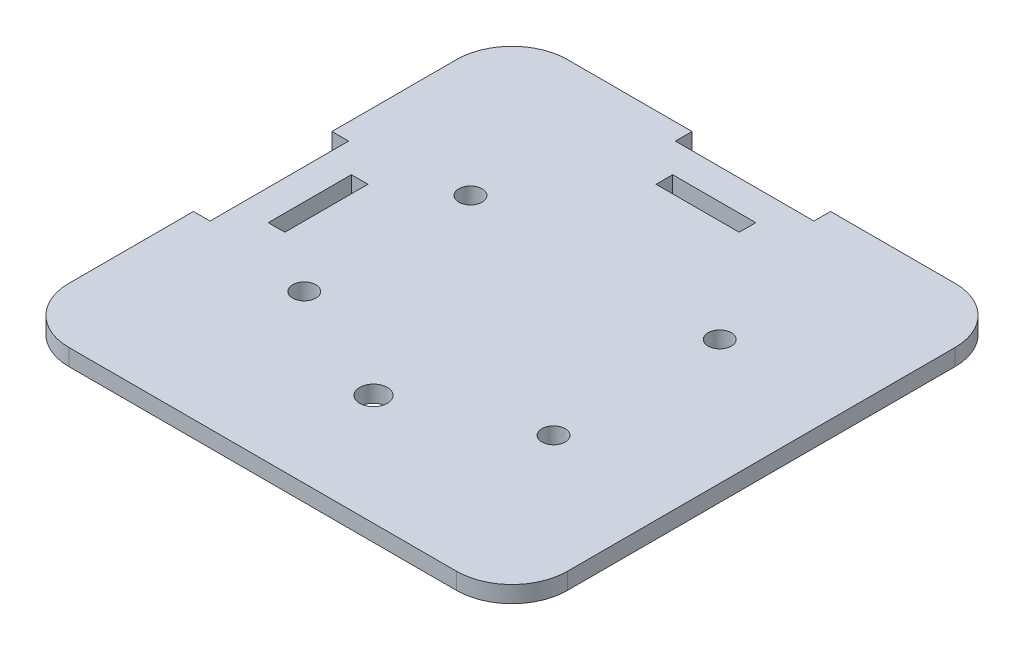
ISO-10303-21;
HEADER;
FILE_DESCRIPTION(('STEP AP214'),'2;1');
FILE_NAME('part.step','',(''),(''),'','','');
FILE_SCHEMA(('AUTOMOTIVE_DESIGN { 1 0 10303 214 1 1 1 1 }'));
ENDSEC;
DATA;
#1=APPLICATION_CONTEXT('core data for automotive mechanical design processes');
#2=APPLICATION_PROTOCOL_DEFINITION('international standard','automotive_design',2000,#1);
#3=PRODUCT_CONTEXT('',#1,'mechanical');
#4=PRODUCT('Part','Part','',(#3));
#5=PRODUCT_RELATED_PRODUCT_CATEGORY('part','',(#4));
#6=PRODUCT_DEFINITION_FORMATION('','',#4);
#7=PRODUCT_DEFINITION_CONTEXT('part definition',#1,'design');
#8=PRODUCT_DEFINITION('design','',#6,#7);
#9=PRODUCT_DEFINITION_SHAPE('','',#8);
#10=(LENGTH_UNIT() NAMED_UNIT(*) SI_UNIT(.MILLI.,.METRE.));
#11=(NAMED_UNIT(*) PLANE_ANGLE_UNIT() SI_UNIT($,.RADIAN.));
#12=(NAMED_UNIT(*) SI_UNIT($,.STERADIAN.) SOLID_ANGLE_UNIT());
#13=UNCERTAINTY_MEASURE_WITH_UNIT(LENGTH_MEASURE(1.E-05),#10,'distance_accuracy_value','');
#14=(GEOMETRIC_REPRESENTATION_CONTEXT(3) GLOBAL_UNCERTAINTY_ASSIGNED_CONTEXT((#13)) GLOBAL_UNIT_ASSIGNED_CONTEXT((#10,
#11,#12)) REPRESENTATION_CONTEXT('',''));
#15=CARTESIAN_POINT('',(0.,0.,0.));
#16=DIRECTION('',(0.,0.,1.));
#17=DIRECTION('',(1.,0.,0.));
#18=AXIS2_PLACEMENT_3D('',#15,#16,#17);
#19=CARTESIAN_POINT('',(-35.,3.,-35.));
#20=DIRECTION('',(0.,-1.,0.));
#21=DIRECTION('',(0.,0.,-1.));
#22=AXIS2_PLACEMENT_3D('',#19,#20,#21);
#23=CYLINDRICAL_SURFACE('',#22,10.);
#24=CARTESIAN_POINT('',(-35.,0.,-35.));
#25=DIRECTION('',(0.,1.,0.));
#26=DIRECTION('',(0.,0.,1.));
#27=AXIS2_PLACEMENT_3D('',#24,#25,#26);
#28=CIRCLE('',#27,10.);
#29=CARTESIAN_POINT('',(-45.,0.,-35.));
#30=VERTEX_POINT('',#29);
#31=CARTESIAN_POINT('',(-35.,0.,-45.));
#32=VERTEX_POINT('',#31);
#33=EDGE_CURVE('E269',#30,#32,#28,.F.);
#34=ORIENTED_EDGE('',*,*,#33,.F.);
#35=DIRECTION('',(0.,-1.,0.));
#36=VECTOR('',#35,1.);
#37=CARTESIAN_POINT('',(-45.,3.,-35.));
#38=LINE('',#37,#36);
#39=CARTESIAN_POINT('',(-45.,3.,-35.));
#40=VERTEX_POINT('',#39);
#41=EDGE_CURVE('E381',#40,#30,#38,.T.);
#42=ORIENTED_EDGE('',*,*,#41,.F.);
#43=CARTESIAN_POINT('',(-35.,3.,-35.));
#44=DIRECTION('',(0.,1.,0.));
#45=DIRECTION('',(0.,0.,1.));
#46=AXIS2_PLACEMENT_3D('',#43,#44,#45);
#47=CIRCLE('',#46,10.);
#48=CARTESIAN_POINT('',(-35.,3.,-45.));
#49=VERTEX_POINT('',#48);
#50=EDGE_CURVE('E272',#40,#49,#47,.F.);
#51=ORIENTED_EDGE('',*,*,#50,.T.);
#52=DIRECTION('',(0.,-1.,0.));
#53=VECTOR('',#52,1.);
#54=CARTESIAN_POINT('',(-35.,3.,-45.));
#55=LINE('',#54,#53);
#56=EDGE_CURVE('E346',#49,#32,#55,.T.);
#57=ORIENTED_EDGE('',*,*,#56,.T.);
#58=EDGE_LOOP('',(#34,#42,#51,#57));
#59=FACE_BOUND('',#58,.T.);
#60=ADVANCED_FACE('F35',(#59),#23,.T.);
#61=CARTESIAN_POINT('',(-45.,3.,0.));
#62=DIRECTION('',(-1.,0.,0.));
#63=DIRECTION('',(0.,0.,1.));
#64=AXIS2_PLACEMENT_3D('',#61,#62,#63);
#65=PLANE('',#64);
#66=DIRECTION('',(0.,0.,-1.));
#67=VECTOR('',#66,1.);
#68=CARTESIAN_POINT('',(-45.,0.,0.));
#69=LINE('',#68,#67);
#70=CARTESIAN_POINT('',(-45.,0.,-12.5));
#71=VERTEX_POINT('',#70);
#72=EDGE_CURVE('E311',#71,#30,#69,.T.);
#73=ORIENTED_EDGE('',*,*,#72,.F.);
#74=DIRECTION('',(0.,-1.,0.));
#75=VECTOR('',#74,1.);
#76=CARTESIAN_POINT('',(-45.,3.,-12.5));
#77=LINE('',#76,#75);
#78=CARTESIAN_POINT('',(-45.,3.,-12.5));
#79=VERTEX_POINT('',#78);
#80=EDGE_CURVE('E379',#79,#71,#77,.T.);
#81=ORIENTED_EDGE('',*,*,#80,.F.);
#82=DIRECTION('',(0.,0.,-1.));
#83=VECTOR('',#82,1.);
#84=CARTESIAN_POINT('',(-45.,3.,0.));
#85=LINE('',#84,#83);
#86=EDGE_CURVE('E275',#79,#40,#85,.T.);
#87=ORIENTED_EDGE('',*,*,#86,.T.);
#88=ORIENTED_EDGE('',*,*,#41,.T.);
#89=EDGE_LOOP('',(#73,#81,#87,#88));
#90=FACE_BOUND('',#89,.T.);
#91=ADVANCED_FACE('F420',(#90),#65,.T.);
#92=CARTESIAN_POINT('',(0.,3.,-12.5));
#93=DIRECTION('',(0.,0.,-1.));
#94=DIRECTION('',(-1.,0.,0.));
#95=AXIS2_PLACEMENT_3D('',#92,#93,#94);
#96=PLANE('',#95);
#97=DIRECTION('',(1.,0.,0.));
#98=VECTOR('',#97,1.);
#99=CARTESIAN_POINT('',(0.,0.,-12.5));
#100=LINE('',#99,#98);
#101=CARTESIAN_POINT('',(-42.,0.,-12.5));
#102=VERTEX_POINT('',#101);
#103=EDGE_CURVE('E314',#71,#102,#100,.T.);
#104=ORIENTED_EDGE('',*,*,#103,.T.);
#105=DIRECTION('',(0.,-1.,0.));
#106=VECTOR('',#105,1.);
#107=CARTESIAN_POINT('',(-42.,3.,-12.5));
#108=LINE('',#107,#106);
#109=CARTESIAN_POINT('',(-42.,3.,-12.5));
#110=VERTEX_POINT('',#109);
#111=EDGE_CURVE('E376',#110,#102,#108,.T.);
#112=ORIENTED_EDGE('',*,*,#111,.F.);
#113=DIRECTION('',(1.,0.,0.));
#114=VECTOR('',#113,1.);
#115=CARTESIAN_POINT('',(0.,3.,-12.5));
#116=LINE('',#115,#114);
#117=EDGE_CURVE('E279',#79,#110,#116,.T.);
#118=ORIENTED_EDGE('',*,*,#117,.F.);
#119=ORIENTED_EDGE('',*,*,#80,.T.);
#120=EDGE_LOOP('',(#104,#112,#118,#119));
#121=FACE_BOUND('',#120,.T.);
#122=ADVANCED_FACE('F425',(#121),#96,.F.);
#123=CARTESIAN_POINT('',(-42.,3.,0.));
#124=DIRECTION('',(1.,0.,0.));
#125=DIRECTION('',(0.,0.,-1.));
#126=AXIS2_PLACEMENT_3D('',#123,#124,#125);
#127=PLANE('',#126);
#128=DIRECTION('',(0.,0.,1.));
#129=VECTOR('',#128,1.);
#130=CARTESIAN_POINT('',(-42.,0.,0.));
#131=LINE('',#130,#129);
#132=CARTESIAN_POINT('',(-42.,0.,12.5));
#133=VERTEX_POINT('',#132);
#134=EDGE_CURVE('E317',#102,#133,#131,.T.);
#135=ORIENTED_EDGE('',*,*,#134,.T.);
#136=DIRECTION('',(0.,-1.,0.));
#137=VECTOR('',#136,1.);
#138=CARTESIAN_POINT('',(-42.,3.,12.5));
#139=LINE('',#138,#137);
#140=CARTESIAN_POINT('',(-42.,3.,12.5));
#141=VERTEX_POINT('',#140);
#142=EDGE_CURVE('E374',#141,#133,#139,.T.);
#143=ORIENTED_EDGE('',*,*,#142,.F.);
#144=DIRECTION('',(0.,0.,1.));
#145=VECTOR('',#144,1.);
#146=CARTESIAN_POINT('',(-42.,3.,0.));
#147=LINE('',#146,#145);
#148=EDGE_CURVE('E282',#110,#141,#147,.T.);
#149=ORIENTED_EDGE('',*,*,#148,.F.);
#150=ORIENTED_EDGE('',*,*,#111,.T.);
#151=EDGE_LOOP('',(#135,#143,#149,#150));
#152=FACE_BOUND('',#151,.T.);
#153=ADVANCED_FACE('F497',(#152),#127,.F.);
#154=CARTESIAN_POINT('',(0.,3.,12.5));
#155=DIRECTION('',(0.,0.,-1.));
#156=DIRECTION('',(-1.,0.,0.));
#157=AXIS2_PLACEMENT_3D('',#154,#155,#156);
#158=PLANE('',#157);
#159=DIRECTION('',(1.,0.,0.));
#160=VECTOR('',#159,1.);
#161=CARTESIAN_POINT('',(0.,0.,12.5));
#162=LINE('',#161,#160);
#163=CARTESIAN_POINT('',(-45.,0.,12.5));
#164=VERTEX_POINT('',#163);
#165=EDGE_CURVE('E320',#164,#133,#162,.T.);
#166=ORIENTED_EDGE('',*,*,#165,.F.);
#167=DIRECTION('',(0.,-1.,0.));
#168=VECTOR('',#167,1.);
#169=CARTESIAN_POINT('',(-45.,3.,12.5));
#170=LINE('',#169,#168);
#171=CARTESIAN_POINT('',(-45.,3.,12.5));
#172=VERTEX_POINT('',#171);
#173=EDGE_CURVE('E372',#172,#164,#170,.T.);
#174=ORIENTED_EDGE('',*,*,#173,.F.);
#175=DIRECTION('',(1.,0.,0.));
#176=VECTOR('',#175,1.);
#177=CARTESIAN_POINT('',(0.,3.,12.5));
#178=LINE('',#177,#176);
#179=EDGE_CURVE('E284',#172,#141,#178,.T.);
#180=ORIENTED_EDGE('',*,*,#179,.T.);
#181=ORIENTED_EDGE('',*,*,#142,.T.);
#182=EDGE_LOOP('',(#166,#174,#180,#181));
#183=FACE_BOUND('',#182,.T.);
#184=ADVANCED_FACE('F494',(#183),#158,.T.);
#185=CARTESIAN_POINT('',(-45.,0.,35.));
#186=VERTEX_POINT('',#185);
#187=EDGE_CURVE('E315',#186,#164,#69,.T.);
#188=ORIENTED_EDGE('',*,*,#187,.F.);
#189=DIRECTION('',(0.,-1.,0.));
#190=VECTOR('',#189,1.);
#191=CARTESIAN_POINT('',(-45.,3.,35.));
#192=LINE('',#191,#190);
#193=CARTESIAN_POINT('',(-45.,3.,35.));
#194=VERTEX_POINT('',#193);
#195=EDGE_CURVE('E370',#194,#186,#192,.T.);
#196=ORIENTED_EDGE('',*,*,#195,.F.);
#197=EDGE_CURVE('E280',#194,#172,#85,.T.);
#198=ORIENTED_EDGE('',*,*,#197,.T.);
#199=ORIENTED_EDGE('',*,*,#173,.T.);
#200=EDGE_LOOP('',(#188,#196,#198,#199));
#201=FACE_BOUND('',#200,.T.);
#202=ADVANCED_FACE('F428',(#201),#65,.T.);
#203=CARTESIAN_POINT('',(-35.,3.,35.));
#204=DIRECTION('',(0.,-1.,0.));
#205=DIRECTION('',(0.,0.,-1.));
#206=AXIS2_PLACEMENT_3D('',#203,#204,#205);
#207=CYLINDRICAL_SURFACE('',#206,10.);
#208=CARTESIAN_POINT('',(-35.,0.,35.));
#209=DIRECTION('',(0.,1.,0.));
#210=DIRECTION('',(0.,0.,1.));
#211=AXIS2_PLACEMENT_3D('',#208,#209,#210);
#212=CIRCLE('',#211,10.);
#213=CARTESIAN_POINT('',(-35.,0.,45.));
#214=VERTEX_POINT('',#213);
#215=EDGE_CURVE('E323',#186,#214,#212,.T.);
#216=ORIENTED_EDGE('',*,*,#215,.T.);
#217=DIRECTION('',(0.,-1.,0.));
#218=VECTOR('',#217,1.);
#219=CARTESIAN_POINT('',(-35.,3.,45.));
#220=LINE('',#219,#218);
#221=CARTESIAN_POINT('',(-35.,3.,45.));
#222=VERTEX_POINT('',#221);
#223=EDGE_CURVE('E368',#222,#214,#220,.T.);
#224=ORIENTED_EDGE('',*,*,#223,.F.);
#225=CARTESIAN_POINT('',(-35.,3.,35.));
#226=DIRECTION('',(0.,1.,0.));
#227=DIRECTION('',(0.,0.,1.));
#228=AXIS2_PLACEMENT_3D('',#225,#226,#227);
#229=CIRCLE('',#228,10.);
#230=EDGE_CURVE('E287',#194,#222,#229,.T.);
#231=ORIENTED_EDGE('',*,*,#230,.F.);
#232=ORIENTED_EDGE('',*,*,#195,.T.);
#233=EDGE_LOOP('',(#216,#224,#231,#232));
#234=FACE_BOUND('',#233,.T.);
#235=ADVANCED_FACE('F509',(#234),#207,.T.);
#236=CARTESIAN_POINT('',(0.,3.,45.));
#237=DIRECTION('',(0.,0.,1.));
#238=DIRECTION('',(1.,0.,0.));
#239=AXIS2_PLACEMENT_3D('',#236,#237,#238);
#240=PLANE('',#239);
#241=DIRECTION('',(-1.,0.,0.));
#242=VECTOR('',#241,1.);
#243=CARTESIAN_POINT('',(0.,0.,45.));
#244=LINE('',#243,#242);
#245=CARTESIAN_POINT('',(35.,0.,45.));
#246=VERTEX_POINT('',#245);
#247=EDGE_CURVE('E326',#246,#214,#244,.T.);
#248=ORIENTED_EDGE('',*,*,#247,.F.);
#249=DIRECTION('',(0.,-1.,0.));
#250=VECTOR('',#249,1.);
#251=CARTESIAN_POINT('',(35.,3.,45.));
#252=LINE('',#251,#250);
#253=CARTESIAN_POINT('',(35.,3.,45.));
#254=VERTEX_POINT('',#253);
#255=EDGE_CURVE('E366',#254,#246,#252,.T.);
#256=ORIENTED_EDGE('',*,*,#255,.F.);
#257=DIRECTION('',(-1.,0.,0.));
#258=VECTOR('',#257,1.);
#259=CARTESIAN_POINT('',(0.,3.,45.));
#260=LINE('',#259,#258);
#261=EDGE_CURVE('E289',#254,#222,#260,.T.);
#262=ORIENTED_EDGE('',*,*,#261,.T.);
#263=ORIENTED_EDGE('',*,*,#223,.T.);
#264=EDGE_LOOP('',(#248,#256,#262,#263));
#265=FACE_BOUND('',#264,.T.);
#266=ADVANCED_FACE('F481',(#265),#240,.T.);
#267=CARTESIAN_POINT('',(35.,3.,35.));
#268=DIRECTION('',(0.,-1.,0.));
#269=DIRECTION('',(0.,0.,-1.));
#270=AXIS2_PLACEMENT_3D('',#267,#268,#269);
#271=CYLINDRICAL_SURFACE('',#270,10.);
#272=CARTESIAN_POINT('',(35.,0.,35.));
#273=DIRECTION('',(0.,1.,0.));
#274=DIRECTION('',(0.,0.,1.));
#275=AXIS2_PLACEMENT_3D('',#272,#273,#274);
#276=CIRCLE('',#275,10.);
#277=CARTESIAN_POINT('',(45.,0.,35.));
#278=VERTEX_POINT('',#277);
#279=EDGE_CURVE('E329',#246,#278,#276,.T.);
#280=ORIENTED_EDGE('',*,*,#279,.T.);
#281=DIRECTION('',(0.,-1.,0.));
#282=VECTOR('',#281,1.);
#283=CARTESIAN_POINT('',(45.,3.,35.));
#284=LINE('',#283,#282);
#285=CARTESIAN_POINT('',(45.,3.,35.));
#286=VERTEX_POINT('',#285);
#287=EDGE_CURVE('E363',#286,#278,#284,.T.);
#288=ORIENTED_EDGE('',*,*,#287,.F.);
#289=CARTESIAN_POINT('',(35.,3.,35.));
#290=DIRECTION('',(0.,1.,0.));
#291=DIRECTION('',(0.,0.,1.));
#292=AXIS2_PLACEMENT_3D('',#289,#290,#291);
#293=CIRCLE('',#292,10.);
#294=EDGE_CURVE('E292',#254,#286,#293,.T.);
#295=ORIENTED_EDGE('',*,*,#294,.F.);
#296=ORIENTED_EDGE('',*,*,#255,.T.);
#297=EDGE_LOOP('',(#280,#288,#295,#296));
#298=FACE_BOUND('',#297,.T.);
#299=ADVANCED_FACE('F478',(#298),#271,.T.);
#300=CARTESIAN_POINT('',(45.,3.,0.));
#301=DIRECTION('',(-1.,0.,0.));
#302=DIRECTION('',(0.,0.,1.));
#303=AXIS2_PLACEMENT_3D('',#300,#301,#302);
#304=PLANE('',#303);
#305=DIRECTION('',(0.,0.,-1.));
#306=VECTOR('',#305,1.);
#307=CARTESIAN_POINT('',(45.,0.,0.));
#308=LINE('',#307,#306);
#309=CARTESIAN_POINT('',(45.,0.,-35.));
#310=VERTEX_POINT('',#309);
#311=EDGE_CURVE('E331',#278,#310,#308,.T.);
#312=ORIENTED_EDGE('',*,*,#311,.T.);
#313=DIRECTION('',(0.,-1.,0.));
#314=VECTOR('',#313,1.);
#315=CARTESIAN_POINT('',(45.,3.,-35.));
#316=LINE('',#315,#314);
#317=CARTESIAN_POINT('',(45.,3.,-35.));
#318=VERTEX_POINT('',#317);
#319=EDGE_CURVE('E360',#318,#310,#316,.T.);
#320=ORIENTED_EDGE('',*,*,#319,.F.);
#321=DIRECTION('',(0.,0.,-1.));
#322=VECTOR('',#321,1.);
#323=CARTESIAN_POINT('',(45.,3.,0.));
#324=LINE('',#323,#322);
#325=EDGE_CURVE('E294',#286,#318,#324,.T.);
#326=ORIENTED_EDGE('',*,*,#325,.F.);
#327=ORIENTED_EDGE('',*,*,#287,.T.);
#328=EDGE_LOOP('',(#312,#320,#326,#327));
#329=FACE_BOUND('',#328,.T.);
#330=ADVANCED_FACE('F473',(#329),#304,.F.);
#331=CARTESIAN_POINT('',(35.,3.,-35.));
#332=DIRECTION('',(0.,-1.,0.));
#333=DIRECTION('',(0.,0.,-1.));
#334=AXIS2_PLACEMENT_3D('',#331,#332,#333);
#335=CYLINDRICAL_SURFACE('',#334,10.);
#336=CARTESIAN_POINT('',(35.,0.,-35.));
#337=DIRECTION('',(0.,1.,0.));
#338=DIRECTION('',(0.,0.,1.));
#339=AXIS2_PLACEMENT_3D('',#336,#337,#338);
#340=CIRCLE('',#339,10.);
#341=CARTESIAN_POINT('',(35.,0.,-45.));
#342=VERTEX_POINT('',#341);
#343=EDGE_CURVE('E333',#310,#342,#340,.T.);
#344=ORIENTED_EDGE('',*,*,#343,.T.);
#345=DIRECTION('',(0.,-1.,0.));
#346=VECTOR('',#345,1.);
#347=CARTESIAN_POINT('',(35.,3.,-45.));
#348=LINE('',#347,#346);
#349=CARTESIAN_POINT('',(35.,3.,-45.));
#350=VERTEX_POINT('',#349);
#351=EDGE_CURVE('E357',#350,#342,#348,.T.);
#352=ORIENTED_EDGE('',*,*,#351,.F.);
#353=CARTESIAN_POINT('',(35.,3.,-35.));
#354=DIRECTION('',(0.,1.,0.));
#355=DIRECTION('',(0.,0.,1.));
#356=AXIS2_PLACEMENT_3D('',#353,#354,#355);
#357=CIRCLE('',#356,10.);
#358=EDGE_CURVE('E296',#318,#350,#357,.T.);
#359=ORIENTED_EDGE('',*,*,#358,.F.);
#360=ORIENTED_EDGE('',*,*,#319,.T.);
#361=EDGE_LOOP('',(#344,#352,#359,#360));
#362=FACE_BOUND('',#361,.T.);
#363=ADVANCED_FACE('F467',(#362),#335,.T.);
#364=CARTESIAN_POINT('',(0.,3.,-45.));
#365=DIRECTION('',(0.,0.,1.));
#366=DIRECTION('',(1.,0.,0.));
#367=AXIS2_PLACEMENT_3D('',#364,#365,#366);
#368=PLANE('',#367);
#369=DIRECTION('',(-1.,0.,0.));
#370=VECTOR('',#369,1.);
#371=CARTESIAN_POINT('',(0.,0.,-45.));
#372=LINE('',#371,#370);
#373=CARTESIAN_POINT('',(12.5,0.,-45.));
#374=VERTEX_POINT('',#373);
#375=EDGE_CURVE('E335',#342,#374,#372,.T.);
#376=ORIENTED_EDGE('',*,*,#375,.T.);
#377=DIRECTION('',(0.,-1.,0.));
#378=VECTOR('',#377,1.);
#379=CARTESIAN_POINT('',(12.5,3.,-45.));
#380=LINE('',#379,#378);
#381=CARTESIAN_POINT('',(12.5,3.,-45.));
#382=VERTEX_POINT('',#381);
#383=EDGE_CURVE('E354',#382,#374,#380,.T.);
#384=ORIENTED_EDGE('',*,*,#383,.F.);
#385=DIRECTION('',(-1.,0.,0.));
#386=VECTOR('',#385,1.);
#387=CARTESIAN_POINT('',(0.,3.,-45.));
#388=LINE('',#387,#386);
#389=EDGE_CURVE('E298',#350,#382,#388,.T.);
#390=ORIENTED_EDGE('',*,*,#389,.F.);
#391=ORIENTED_EDGE('',*,*,#351,.T.);
#392=EDGE_LOOP('',(#376,#384,#390,#391));
#393=FACE_BOUND('',#392,.T.);
#394=ADVANCED_FACE('F463',(#393),#368,.F.);
#395=CARTESIAN_POINT('',(12.5,3.,0.));
#396=DIRECTION('',(1.,0.,0.));
#397=DIRECTION('',(0.,0.,-1.));
#398=AXIS2_PLACEMENT_3D('',#395,#396,#397);
#399=PLANE('',#398);
#400=DIRECTION('',(0.,0.,1.));
#401=VECTOR('',#400,1.);
#402=CARTESIAN_POINT('',(12.5,0.,0.));
#403=LINE('',#402,#401);
#404=CARTESIAN_POINT('',(12.5,0.,-42.));
#405=VERTEX_POINT('',#404);
#406=EDGE_CURVE('E337',#374,#405,#403,.T.);
#407=ORIENTED_EDGE('',*,*,#406,.T.);
#408=DIRECTION('',(0.,-1.,0.));
#409=VECTOR('',#408,1.);
#410=CARTESIAN_POINT('',(12.5,3.,-42.));
#411=LINE('',#410,#409);
#412=CARTESIAN_POINT('',(12.5,3.,-42.));
#413=VERTEX_POINT('',#412);
#414=EDGE_CURVE('E352',#413,#405,#411,.T.);
#415=ORIENTED_EDGE('',*,*,#414,.F.);
#416=DIRECTION('',(0.,0.,1.));
#417=VECTOR('',#416,1.);
#418=CARTESIAN_POINT('',(12.5,3.,0.));
#419=LINE('',#418,#417);
#420=EDGE_CURVE('E300',#382,#413,#419,.T.);
#421=ORIENTED_EDGE('',*,*,#420,.F.);
#422=ORIENTED_EDGE('',*,*,#383,.T.);
#423=EDGE_LOOP('',(#407,#415,#421,#422));
#424=FACE_BOUND('',#423,.T.);
#425=ADVANCED_FACE('F458',(#424),#399,.F.);
#426=CARTESIAN_POINT('',(0.,3.,-42.));
#427=DIRECTION('',(0.,0.,-1.));
#428=DIRECTION('',(-1.,0.,0.));
#429=AXIS2_PLACEMENT_3D('',#426,#427,#428);
#430=PLANE('',#429);
#431=DIRECTION('',(1.,0.,0.));
#432=VECTOR('',#431,1.);
#433=CARTESIAN_POINT('',(0.,0.,-42.));
#434=LINE('',#433,#432);
#435=CARTESIAN_POINT('',(-12.5,0.,-42.));
#436=VERTEX_POINT('',#435);
#437=EDGE_CURVE('E340',#436,#405,#434,.T.);
#438=ORIENTED_EDGE('',*,*,#437,.F.);
#439=DIRECTION('',(0.,-1.,0.));
#440=VECTOR('',#439,1.);
#441=CARTESIAN_POINT('',(-12.5,3.,-42.));
#442=LINE('',#441,#440);
#443=CARTESIAN_POINT('',(-12.5,3.,-42.));
#444=VERTEX_POINT('',#443);
#445=EDGE_CURVE('E350',#444,#436,#442,.T.);
#446=ORIENTED_EDGE('',*,*,#445,.F.);
#447=DIRECTION('',(1.,0.,0.));
#448=VECTOR('',#447,1.);
#449=CARTESIAN_POINT('',(0.,3.,-42.));
#450=LINE('',#449,#448);
#451=EDGE_CURVE('E303',#444,#413,#450,.T.);
#452=ORIENTED_EDGE('',*,*,#451,.T.);
#453=ORIENTED_EDGE('',*,*,#414,.T.);
#454=EDGE_LOOP('',(#438,#446,#452,#453));
#455=FACE_BOUND('',#454,.T.);
#456=ADVANCED_FACE('F452',(#455),#430,.T.);
#457=CARTESIAN_POINT('',(-12.5,3.,0.));
#458=DIRECTION('',(1.,0.,0.));
#459=DIRECTION('',(0.,0.,-1.));
#460=AXIS2_PLACEMENT_3D('',#457,#458,#459);
#461=PLANE('',#460);
#462=DIRECTION('',(0.,0.,1.));
#463=VECTOR('',#462,1.);
#464=CARTESIAN_POINT('',(-12.5,0.,0.));
#465=LINE('',#464,#463);
#466=CARTESIAN_POINT('',(-12.5,0.,-45.));
#467=VERTEX_POINT('',#466);
#468=EDGE_CURVE('E343',#467,#436,#465,.T.);
#469=ORIENTED_EDGE('',*,*,#468,.F.);
#470=DIRECTION('',(0.,-1.,0.));
#471=VECTOR('',#470,1.);
#472=CARTESIAN_POINT('',(-12.5,3.,-45.));
#473=LINE('',#472,#471);
#474=CARTESIAN_POINT('',(-12.5,3.,-45.));
#475=VERTEX_POINT('',#474);
#476=EDGE_CURVE('E348',#475,#467,#473,.T.);
#477=ORIENTED_EDGE('',*,*,#476,.F.);
#478=DIRECTION('',(0.,0.,1.));
#479=VECTOR('',#478,1.);
#480=CARTESIAN_POINT('',(-12.5,3.,0.));
#481=LINE('',#480,#479);
#482=EDGE_CURVE('E306',#475,#444,#481,.T.);
#483=ORIENTED_EDGE('',*,*,#482,.T.);
#484=ORIENTED_EDGE('',*,*,#445,.T.);
#485=EDGE_LOOP('',(#469,#477,#483,#484));
#486=FACE_BOUND('',#485,.T.);
#487=ADVANCED_FACE('F449',(#486),#461,.T.);
#488=EDGE_CURVE('E276',#467,#32,#372,.T.);
#489=ORIENTED_EDGE('',*,*,#488,.T.);
#490=ORIENTED_EDGE('',*,*,#56,.F.);
#491=EDGE_CURVE('E301',#475,#49,#388,.T.);
#492=ORIENTED_EDGE('',*,*,#491,.F.);
#493=ORIENTED_EDGE('',*,*,#476,.T.);
#494=EDGE_LOOP('',(#489,#490,#492,#493));
#495=FACE_BOUND('',#494,.T.);
#496=ADVANCED_FACE('F446',(#495),#368,.F.);
#497=CARTESIAN_POINT('',(0.,3.,0.));
#498=DIRECTION('',(0.,1.,0.));
#499=DIRECTION('',(0.,0.,1.));
#500=AXIS2_PLACEMENT_3D('',#497,#498,#499);
#501=PLANE('',#500);
#502=CARTESIAN_POINT('',(0.,3.,25.));
#503=DIRECTION('',(0.,1.,0.));
#504=DIRECTION('',(0.,0.,1.));
#505=AXIS2_PLACEMENT_3D('',#502,#503,#504);
#506=CIRCLE('',#505,2.5);
#507=CARTESIAN_POINT('',(0.,3.,27.5));
#508=VERTEX_POINT('',#507);
#509=EDGE_CURVE('E652',#508,#508,#506,.T.);
#510=ORIENTED_EDGE('',*,*,#509,.F.);
#511=EDGE_LOOP('',(#510));
#512=FACE_BOUND('',#511,.T.);
#513=DIRECTION('',(0.,0.,1.));
#514=VECTOR('',#513,1.);
#515=CARTESIAN_POINT('',(-7.5,3.,-33.5));
#516=LINE('',#515,#514);
#517=CARTESIAN_POINT('',(-7.5,3.,-36.5));
#518=VERTEX_POINT('',#517);
#519=CARTESIAN_POINT('',(-7.5,3.,-33.5));
#520=VERTEX_POINT('',#519);
#521=EDGE_CURVE('E50',#518,#520,#516,.T.);
#522=ORIENTED_EDGE('',*,*,#521,.F.);
#523=DIRECTION('',(-1.,0.,0.));
#524=VECTOR('',#523,1.);
#525=CARTESIAN_POINT('',(7.5,3.,-36.5));
#526=LINE('',#525,#524);
#527=CARTESIAN_POINT('',(7.5,3.,-36.5));
#528=VERTEX_POINT('',#527);
#529=EDGE_CURVE('E220',#528,#518,#526,.T.);
#530=ORIENTED_EDGE('',*,*,#529,.F.);
#531=DIRECTION('',(0.,0.,-1.));
#532=VECTOR('',#531,1.);
#533=CARTESIAN_POINT('',(7.5,3.,-33.5));
#534=LINE('',#533,#532);
#535=CARTESIAN_POINT('',(7.5,3.,-33.5));
#536=VERTEX_POINT('',#535);
#537=EDGE_CURVE('E203',#536,#528,#534,.T.);
#538=ORIENTED_EDGE('',*,*,#537,.F.);
#539=DIRECTION('',(1.,0.,0.));
#540=VECTOR('',#539,1.);
#541=CARTESIAN_POINT('',(7.5,3.,-33.5));
#542=LINE('',#541,#540);
#543=EDGE_CURVE('E213',#520,#536,#542,.T.);
#544=ORIENTED_EDGE('',*,*,#543,.F.);
#545=EDGE_LOOP('',(#522,#530,#538,#544));
#546=FACE_BOUND('',#545,.T.);
#547=DIRECTION('',(0.,0.,-1.));
#548=VECTOR('',#547,1.);
#549=CARTESIAN_POINT('',(-33.5,3.,7.5));
#550=LINE('',#549,#548);
#551=CARTESIAN_POINT('',(-33.5,3.,7.5));
#552=VERTEX_POINT('',#551);
#553=CARTESIAN_POINT('',(-33.5,3.,-7.5));
#554=VERTEX_POINT('',#553);
#555=EDGE_CURVE('E58',#552,#554,#550,.T.);
#556=ORIENTED_EDGE('',*,*,#555,.F.);
#557=DIRECTION('',(1.,0.,0.));
#558=VECTOR('',#557,1.);
#559=CARTESIAN_POINT('',(-36.5,3.,7.5));
#560=LINE('',#559,#558);
#561=CARTESIAN_POINT('',(-36.5,3.,7.5));
#562=VERTEX_POINT('',#561);
#563=EDGE_CURVE('E237',#562,#552,#560,.T.);
#564=ORIENTED_EDGE('',*,*,#563,.F.);
#565=DIRECTION('',(0.,0.,1.));
#566=VECTOR('',#565,1.);
#567=CARTESIAN_POINT('',(-36.5,3.,7.5));
#568=LINE('',#567,#566);
#569=CARTESIAN_POINT('',(-36.5,3.,-7.5));
#570=VERTEX_POINT('',#569);
#571=EDGE_CURVE('E234',#570,#562,#568,.T.);
#572=ORIENTED_EDGE('',*,*,#571,.F.);
#573=DIRECTION('',(-1.,0.,0.));
#574=VECTOR('',#573,1.);
#575=CARTESIAN_POINT('',(-36.5,3.,-7.5));
#576=LINE('',#575,#574);
#577=EDGE_CURVE('E231',#554,#570,#576,.T.);
#578=ORIENTED_EDGE('',*,*,#577,.F.);
#579=EDGE_LOOP('',(#556,#564,#572,#578));
#580=FACE_BOUND('',#579,.T.);
#581=CARTESIAN_POINT('',(-22.5,3.,15.));
#582=DIRECTION('',(0.,1.,0.));
#583=DIRECTION('',(0.,0.,-1.));
#584=AXIS2_PLACEMENT_3D('',#581,#582,#583);
#585=CIRCLE('',#584,2.1);
#586=CARTESIAN_POINT('',(-22.5,3.,12.9));
#587=VERTEX_POINT('',#586);
#588=EDGE_CURVE('E227',#587,#587,#585,.T.);
#589=ORIENTED_EDGE('',*,*,#588,.F.);
#590=EDGE_LOOP('',(#589));
#591=FACE_BOUND('',#590,.T.);
#592=CARTESIAN_POINT('',(22.5,3.,15.));
#593=DIRECTION('',(0.,1.,0.));
#594=DIRECTION('',(0.,0.,1.));
#595=AXIS2_PLACEMENT_3D('',#592,#593,#594);
#596=CIRCLE('',#595,2.1);
#597=CARTESIAN_POINT('',(22.5,3.,17.1));
#598=VERTEX_POINT('',#597);
#599=EDGE_CURVE('E258',#598,#598,#596,.T.);
#600=ORIENTED_EDGE('',*,*,#599,.F.);
#601=EDGE_LOOP('',(#600));
#602=FACE_BOUND('',#601,.T.);
#603=CARTESIAN_POINT('',(22.5,3.,-15.));
#604=DIRECTION('',(0.,1.,0.));
#605=DIRECTION('',(0.,0.,-1.));
#606=AXIS2_PLACEMENT_3D('',#603,#604,#605);
#607=CIRCLE('',#606,2.1);
#608=CARTESIAN_POINT('',(22.5,3.,-17.1));
#609=VERTEX_POINT('',#608);
#610=EDGE_CURVE('E252',#609,#609,#607,.T.);
#611=ORIENTED_EDGE('',*,*,#610,.F.);
#612=EDGE_LOOP('',(#611));
#613=FACE_BOUND('',#612,.T.);
#614=CARTESIAN_POINT('',(-22.5,3.,-15.));
#615=DIRECTION('',(0.,1.,0.));
#616=DIRECTION('',(0.,0.,1.));
#617=AXIS2_PLACEMENT_3D('',#614,#615,#616);
#618=CIRCLE('',#617,2.1);
#619=CARTESIAN_POINT('',(-22.5,3.,-12.9));
#620=VERTEX_POINT('',#619);
#621=EDGE_CURVE('E251',#620,#620,#618,.T.);
#622=ORIENTED_EDGE('',*,*,#621,.F.);
#623=EDGE_LOOP('',(#622));
#624=FACE_BOUND('',#623,.T.);
#625=ORIENTED_EDGE('',*,*,#50,.F.);
#626=ORIENTED_EDGE('',*,*,#86,.F.);
#627=ORIENTED_EDGE('',*,*,#117,.T.);
#628=ORIENTED_EDGE('',*,*,#148,.T.);
#629=ORIENTED_EDGE('',*,*,#179,.F.);
#630=ORIENTED_EDGE('',*,*,#197,.F.);
#631=ORIENTED_EDGE('',*,*,#230,.T.);
#632=ORIENTED_EDGE('',*,*,#261,.F.);
#633=ORIENTED_EDGE('',*,*,#294,.T.);
#634=ORIENTED_EDGE('',*,*,#325,.T.);
#635=ORIENTED_EDGE('',*,*,#358,.T.);
#636=ORIENTED_EDGE('',*,*,#389,.T.);
#637=ORIENTED_EDGE('',*,*,#420,.T.);
#638=ORIENTED_EDGE('',*,*,#451,.F.);
#639=ORIENTED_EDGE('',*,*,#482,.F.);
#640=ORIENTED_EDGE('',*,*,#491,.T.);
#641=EDGE_LOOP('',(#625,#626,#627,#628,#629,#630,#631,#632,#633,#634,#635,#636,#637,#638,#639,#640));
#642=FACE_BOUND('',#641,.T.);
#643=ADVANCED_FACE('F217',(#512,#546,#580,#591,#602,#613,#624,#642),#501,.T.);
#644=CARTESIAN_POINT('',(0.,0.,0.));
#645=DIRECTION('',(0.,1.,0.));
#646=DIRECTION('',(0.,0.,1.));
#647=AXIS2_PLACEMENT_3D('',#644,#645,#646);
#648=PLANE('',#647);
#649=CARTESIAN_POINT('',(0.,0.,25.));
#650=DIRECTION('',(0.,1.,0.));
#651=DIRECTION('',(0.,0.,1.));
#652=AXIS2_PLACEMENT_3D('',#649,#650,#651);
#653=CIRCLE('',#652,2.5);
#654=CARTESIAN_POINT('',(0.,0.,27.5));
#655=VERTEX_POINT('',#654);
#656=EDGE_CURVE('E38',#655,#655,#653,.T.);
#657=ORIENTED_EDGE('',*,*,#656,.T.);
#658=EDGE_LOOP('',(#657));
#659=FACE_BOUND('',#658,.T.);
#660=DIRECTION('',(-1.,0.,0.));
#661=VECTOR('',#660,1.);
#662=CARTESIAN_POINT('',(0.,0.,-36.5));
#663=LINE('',#662,#661);
#664=CARTESIAN_POINT('',(7.5,0.,-36.5));
#665=VERTEX_POINT('',#664);
#666=CARTESIAN_POINT('',(-7.5,0.,-36.5));
#667=VERTEX_POINT('',#666);
#668=EDGE_CURVE('E43',#665,#667,#663,.T.);
#669=ORIENTED_EDGE('',*,*,#668,.T.);
#670=DIRECTION('',(0.,0.,1.));
#671=VECTOR('',#670,1.);
#672=CARTESIAN_POINT('',(-7.5,0.,0.));
#673=LINE('',#672,#671);
#674=CARTESIAN_POINT('',(-7.5,0.,-33.5));
#675=VERTEX_POINT('',#674);
#676=EDGE_CURVE('E11',#667,#675,#673,.T.);
#677=ORIENTED_EDGE('',*,*,#676,.T.);
#678=DIRECTION('',(1.,0.,0.));
#679=VECTOR('',#678,1.);
#680=CARTESIAN_POINT('',(0.,0.,-33.5));
#681=LINE('',#680,#679);
#682=CARTESIAN_POINT('',(7.5,0.,-33.5));
#683=VERTEX_POINT('',#682);
#684=EDGE_CURVE('E395',#675,#683,#681,.T.);
#685=ORIENTED_EDGE('',*,*,#684,.T.);
#686=DIRECTION('',(0.,0.,-1.));
#687=VECTOR('',#686,1.);
#688=CARTESIAN_POINT('',(7.5,0.,0.));
#689=LINE('',#688,#687);
#690=EDGE_CURVE('E206',#683,#665,#689,.T.);
#691=ORIENTED_EDGE('',*,*,#690,.T.);
#692=EDGE_LOOP('',(#669,#677,#685,#691));
#693=FACE_BOUND('',#692,.T.);
#694=DIRECTION('',(1.,0.,0.));
#695=VECTOR('',#694,1.);
#696=CARTESIAN_POINT('',(0.,0.,7.5));
#697=LINE('',#696,#695);
#698=CARTESIAN_POINT('',(-36.5,0.,7.5));
#699=VERTEX_POINT('',#698);
#700=CARTESIAN_POINT('',(-33.5,0.,7.5));
#701=VERTEX_POINT('',#700);
#702=EDGE_CURVE('E389',#699,#701,#697,.T.);
#703=ORIENTED_EDGE('',*,*,#702,.T.);
#704=DIRECTION('',(0.,0.,-1.));
#705=VECTOR('',#704,1.);
#706=CARTESIAN_POINT('',(-33.5,0.,0.));
#707=LINE('',#706,#705);
#708=CARTESIAN_POINT('',(-33.5,0.,-7.5));
#709=VERTEX_POINT('',#708);
#710=EDGE_CURVE('E392',#701,#709,#707,.T.);
#711=ORIENTED_EDGE('',*,*,#710,.T.);
#712=DIRECTION('',(-1.,0.,0.));
#713=VECTOR('',#712,1.);
#714=CARTESIAN_POINT('',(0.,0.,-7.5));
#715=LINE('',#714,#713);
#716=CARTESIAN_POINT('',(-36.5,0.,-7.5));
#717=VERTEX_POINT('',#716);
#718=EDGE_CURVE('E383',#709,#717,#715,.T.);
#719=ORIENTED_EDGE('',*,*,#718,.T.);
#720=DIRECTION('',(0.,0.,1.));
#721=VECTOR('',#720,1.);
#722=CARTESIAN_POINT('',(-36.5,0.,0.));
#723=LINE('',#722,#721);
#724=EDGE_CURVE('E386',#717,#699,#723,.T.);
#725=ORIENTED_EDGE('',*,*,#724,.T.);
#726=EDGE_LOOP('',(#703,#711,#719,#725));
#727=FACE_BOUND('',#726,.T.);
#728=CARTESIAN_POINT('',(-22.5,0.,15.));
#729=DIRECTION('',(0.,1.,0.));
#730=DIRECTION('',(0.,0.,-1.));
#731=AXIS2_PLACEMENT_3D('',#728,#729,#730);
#732=CIRCLE('',#731,2.1);
#733=CARTESIAN_POINT('',(-22.5,0.,12.9));
#734=VERTEX_POINT('',#733);
#735=EDGE_CURVE('E261',#734,#734,#732,.T.);
#736=ORIENTED_EDGE('',*,*,#735,.T.);
#737=EDGE_LOOP('',(#736));
#738=FACE_BOUND('',#737,.T.);
#739=CARTESIAN_POINT('',(22.5,0.,15.));
#740=DIRECTION('',(0.,1.,0.));
#741=DIRECTION('',(0.,0.,1.));
#742=AXIS2_PLACEMENT_3D('',#739,#740,#741);
#743=CIRCLE('',#742,2.1);
#744=CARTESIAN_POINT('',(22.5,0.,17.1));
#745=VERTEX_POINT('',#744);
#746=EDGE_CURVE('E255',#745,#745,#743,.T.);
#747=ORIENTED_EDGE('',*,*,#746,.T.);
#748=EDGE_LOOP('',(#747));
#749=FACE_BOUND('',#748,.T.);
#750=CARTESIAN_POINT('',(22.5,0.,-15.));
#751=DIRECTION('',(0.,1.,0.));
#752=DIRECTION('',(0.,0.,-1.));
#753=AXIS2_PLACEMENT_3D('',#750,#751,#752);
#754=CIRCLE('',#753,2.1);
#755=CARTESIAN_POINT('',(22.5,0.,-17.1));
#756=VERTEX_POINT('',#755);
#757=EDGE_CURVE('E248',#756,#756,#754,.T.);
#758=ORIENTED_EDGE('',*,*,#757,.T.);
#759=EDGE_LOOP('',(#758));
#760=FACE_BOUND('',#759,.T.);
#761=CARTESIAN_POINT('',(-22.5,0.,-15.));
#762=DIRECTION('',(0.,1.,0.));
#763=DIRECTION('',(0.,0.,1.));
#764=AXIS2_PLACEMENT_3D('',#761,#762,#763);
#765=CIRCLE('',#764,2.1);
#766=CARTESIAN_POINT('',(-22.5,0.,-12.9));
#767=VERTEX_POINT('',#766);
#768=EDGE_CURVE('E266',#767,#767,#765,.T.);
#769=ORIENTED_EDGE('',*,*,#768,.T.);
#770=EDGE_LOOP('',(#769));
#771=FACE_BOUND('',#770,.T.);
#772=ORIENTED_EDGE('',*,*,#33,.T.);
#773=ORIENTED_EDGE('',*,*,#488,.F.);
#774=ORIENTED_EDGE('',*,*,#468,.T.);
#775=ORIENTED_EDGE('',*,*,#437,.T.);
#776=ORIENTED_EDGE('',*,*,#406,.F.);
#777=ORIENTED_EDGE('',*,*,#375,.F.);
#778=ORIENTED_EDGE('',*,*,#343,.F.);
#779=ORIENTED_EDGE('',*,*,#311,.F.);
#780=ORIENTED_EDGE('',*,*,#279,.F.);
#781=ORIENTED_EDGE('',*,*,#247,.T.);
#782=ORIENTED_EDGE('',*,*,#215,.F.);
#783=ORIENTED_EDGE('',*,*,#187,.T.);
#784=ORIENTED_EDGE('',*,*,#165,.T.);
#785=ORIENTED_EDGE('',*,*,#134,.F.);
#786=ORIENTED_EDGE('',*,*,#103,.F.);
#787=ORIENTED_EDGE('',*,*,#72,.T.);
#788=EDGE_LOOP('',(#772,#773,#774,#775,#776,#777,#778,#779,#780,#781,#782,#783,#784,#785,#786,#787));
#789=FACE_BOUND('',#788,.T.);
#790=ADVANCED_FACE('F400',(#659,#693,#727,#738,#749,#760,#771,#789),#648,.F.);
#791=CARTESIAN_POINT('',(-22.5,0.,-15.));
#792=DIRECTION('',(0.,1.,0.));
#793=DIRECTION('',(0.,0.,1.));
#794=AXIS2_PLACEMENT_3D('',#791,#792,#793);
#795=CYLINDRICAL_SURFACE('',#794,2.1);
#796=ORIENTED_EDGE('',*,*,#768,.F.);
#797=EDGE_LOOP('',(#796));
#798=FACE_BOUND('',#797,.T.);
#799=ORIENTED_EDGE('',*,*,#621,.T.);
#800=EDGE_LOOP('',(#799));
#801=FACE_BOUND('',#800,.T.);
#802=ADVANCED_FACE('F530',(#798,#801),#795,.F.);
#803=CARTESIAN_POINT('',(22.5,0.,-15.));
#804=DIRECTION('',(0.,1.,0.));
#805=DIRECTION('',(0.,0.,1.));
#806=AXIS2_PLACEMENT_3D('',#803,#804,#805);
#807=CYLINDRICAL_SURFACE('',#806,2.1);
#808=ORIENTED_EDGE('',*,*,#757,.F.);
#809=EDGE_LOOP('',(#808));
#810=FACE_BOUND('',#809,.T.);
#811=ORIENTED_EDGE('',*,*,#610,.T.);
#812=EDGE_LOOP('',(#811));
#813=FACE_BOUND('',#812,.T.);
#814=ADVANCED_FACE('F537',(#810,#813),#807,.F.);
#815=CARTESIAN_POINT('',(22.5,0.,15.));
#816=DIRECTION('',(0.,1.,0.));
#817=DIRECTION('',(0.,0.,1.));
#818=AXIS2_PLACEMENT_3D('',#815,#816,#817);
#819=CYLINDRICAL_SURFACE('',#818,2.1);
#820=ORIENTED_EDGE('',*,*,#746,.F.);
#821=EDGE_LOOP('',(#820));
#822=FACE_BOUND('',#821,.T.);
#823=ORIENTED_EDGE('',*,*,#599,.T.);
#824=EDGE_LOOP('',(#823));
#825=FACE_BOUND('',#824,.T.);
#826=ADVANCED_FACE('F543',(#822,#825),#819,.F.);
#827=CARTESIAN_POINT('',(-22.5,0.,15.));
#828=DIRECTION('',(0.,1.,0.));
#829=DIRECTION('',(0.,0.,1.));
#830=AXIS2_PLACEMENT_3D('',#827,#828,#829);
#831=CYLINDRICAL_SURFACE('',#830,2.1);
#832=ORIENTED_EDGE('',*,*,#735,.F.);
#833=EDGE_LOOP('',(#832));
#834=FACE_BOUND('',#833,.T.);
#835=ORIENTED_EDGE('',*,*,#588,.T.);
#836=EDGE_LOOP('',(#835));
#837=FACE_BOUND('',#836,.T.);
#838=ADVANCED_FACE('F539',(#834,#837),#831,.F.);
#839=CARTESIAN_POINT('',(-33.5,-7.,7.5));
#840=DIRECTION('',(1.,0.,0.));
#841=DIRECTION('',(0.,0.,-1.));
#842=AXIS2_PLACEMENT_3D('',#839,#840,#841);
#843=PLANE('',#842);
#844=DIRECTION('',(0.,1.,0.));
#845=VECTOR('',#844,1.);
#846=CARTESIAN_POINT('',(-33.5,-7.,7.5));
#847=LINE('',#846,#845);
#848=EDGE_CURVE('E241',#701,#552,#847,.T.);
#849=ORIENTED_EDGE('',*,*,#848,.T.);
#850=ORIENTED_EDGE('',*,*,#555,.T.);
#851=DIRECTION('',(0.,1.,0.));
#852=VECTOR('',#851,1.);
#853=CARTESIAN_POINT('',(-33.5,-7.,-7.5));
#854=LINE('',#853,#852);
#855=EDGE_CURVE('E240',#709,#554,#854,.T.);
#856=ORIENTED_EDGE('',*,*,#855,.F.);
#857=ORIENTED_EDGE('',*,*,#710,.F.);
#858=EDGE_LOOP('',(#849,#850,#856,#857));
#859=FACE_BOUND('',#858,.T.);
#860=ADVANCED_FACE('F542',(#859),#843,.F.);
#861=CARTESIAN_POINT('',(-36.5,-7.,7.5));
#862=DIRECTION('',(0.,0.,1.));
#863=DIRECTION('',(1.,0.,0.));
#864=AXIS2_PLACEMENT_3D('',#861,#862,#863);
#865=PLANE('',#864);
#866=DIRECTION('',(0.,1.,0.));
#867=VECTOR('',#866,1.);
#868=CARTESIAN_POINT('',(-36.5,-7.,7.5));
#869=LINE('',#868,#867);
#870=EDGE_CURVE('E243',#699,#562,#869,.T.);
#871=ORIENTED_EDGE('',*,*,#870,.T.);
#872=ORIENTED_EDGE('',*,*,#563,.T.);
#873=ORIENTED_EDGE('',*,*,#848,.F.);
#874=ORIENTED_EDGE('',*,*,#702,.F.);
#875=EDGE_LOOP('',(#871,#872,#873,#874));
#876=FACE_BOUND('',#875,.T.);
#877=ADVANCED_FACE('F552',(#876),#865,.F.);
#878=CARTESIAN_POINT('',(-36.5,-7.,7.5));
#879=DIRECTION('',(-1.,0.,0.));
#880=DIRECTION('',(0.,0.,1.));
#881=AXIS2_PLACEMENT_3D('',#878,#879,#880);
#882=PLANE('',#881);
#883=DIRECTION('',(0.,1.,0.));
#884=VECTOR('',#883,1.);
#885=CARTESIAN_POINT('',(-36.5,-7.,-7.5));
#886=LINE('',#885,#884);
#887=EDGE_CURVE('E245',#717,#570,#886,.T.);
#888=ORIENTED_EDGE('',*,*,#887,.T.);
#889=ORIENTED_EDGE('',*,*,#571,.T.);
#890=ORIENTED_EDGE('',*,*,#870,.F.);
#891=ORIENTED_EDGE('',*,*,#724,.F.);
#892=EDGE_LOOP('',(#888,#889,#890,#891));
#893=FACE_BOUND('',#892,.T.);
#894=ADVANCED_FACE('F414',(#893),#882,.F.);
#895=CARTESIAN_POINT('',(-36.5,-7.,-7.5));
#896=DIRECTION('',(0.,0.,-1.));
#897=DIRECTION('',(-1.,0.,0.));
#898=AXIS2_PLACEMENT_3D('',#895,#896,#897);
#899=PLANE('',#898);
#900=ORIENTED_EDGE('',*,*,#855,.T.);
#901=ORIENTED_EDGE('',*,*,#577,.T.);
#902=ORIENTED_EDGE('',*,*,#887,.F.);
#903=ORIENTED_EDGE('',*,*,#718,.F.);
#904=EDGE_LOOP('',(#900,#901,#902,#903));
#905=FACE_BOUND('',#904,.T.);
#906=ADVANCED_FACE('F407',(#905),#899,.F.);
#907=CARTESIAN_POINT('',(-7.5,-7.,-33.5));
#908=DIRECTION('',(-1.,0.,0.));
#909=DIRECTION('',(0.,0.,1.));
#910=AXIS2_PLACEMENT_3D('',#907,#908,#909);
#911=PLANE('',#910);
#912=DIRECTION('',(0.,1.,0.));
#913=VECTOR('',#912,1.);
#914=CARTESIAN_POINT('',(-7.5,-7.,-36.5));
#915=LINE('',#914,#913);
#916=EDGE_CURVE('E225',#667,#518,#915,.T.);
#917=ORIENTED_EDGE('',*,*,#916,.T.);
#918=ORIENTED_EDGE('',*,*,#521,.T.);
#919=DIRECTION('',(0.,1.,0.));
#920=VECTOR('',#919,1.);
#921=CARTESIAN_POINT('',(-7.5,-7.,-33.5));
#922=LINE('',#921,#920);
#923=EDGE_CURVE('E210',#675,#520,#922,.T.);
#924=ORIENTED_EDGE('',*,*,#923,.F.);
#925=ORIENTED_EDGE('',*,*,#676,.F.);
#926=EDGE_LOOP('',(#917,#918,#924,#925));
#927=FACE_BOUND('',#926,.T.);
#928=ADVANCED_FACE('F405',(#927),#911,.F.);
#929=CARTESIAN_POINT('',(7.5,-7.,-36.5));
#930=DIRECTION('',(0.,0.,-1.));
#931=DIRECTION('',(-1.,0.,0.));
#932=AXIS2_PLACEMENT_3D('',#929,#930,#931);
#933=PLANE('',#932);
#934=DIRECTION('',(0.,1.,0.));
#935=VECTOR('',#934,1.);
#936=CARTESIAN_POINT('',(7.5,-7.,-36.5));
#937=LINE('',#936,#935);
#938=EDGE_CURVE('E209',#665,#528,#937,.T.);
#939=ORIENTED_EDGE('',*,*,#938,.T.);
#940=ORIENTED_EDGE('',*,*,#529,.T.);
#941=ORIENTED_EDGE('',*,*,#916,.F.);
#942=ORIENTED_EDGE('',*,*,#668,.F.);
#943=EDGE_LOOP('',(#939,#940,#941,#942));
#944=FACE_BOUND('',#943,.T.);
#945=ADVANCED_FACE('F404',(#944),#933,.F.);
#946=CARTESIAN_POINT('',(7.5,-7.,-33.5));
#947=DIRECTION('',(1.,0.,0.));
#948=DIRECTION('',(0.,0.,-1.));
#949=AXIS2_PLACEMENT_3D('',#946,#947,#948);
#950=PLANE('',#949);
#951=DIRECTION('',(0.,1.,0.));
#952=VECTOR('',#951,1.);
#953=CARTESIAN_POINT('',(7.5,-7.,-33.5));
#954=LINE('',#953,#952);
#955=EDGE_CURVE('E198',#683,#536,#954,.T.);
#956=ORIENTED_EDGE('',*,*,#955,.T.);
#957=ORIENTED_EDGE('',*,*,#537,.T.);
#958=ORIENTED_EDGE('',*,*,#938,.F.);
#959=ORIENTED_EDGE('',*,*,#690,.F.);
#960=EDGE_LOOP('',(#956,#957,#958,#959));
#961=FACE_BOUND('',#960,.T.);
#962=ADVANCED_FACE('F200',(#961),#950,.F.);
#963=CARTESIAN_POINT('',(7.5,-7.,-33.5));
#964=DIRECTION('',(0.,0.,1.));
#965=DIRECTION('',(1.,0.,0.));
#966=AXIS2_PLACEMENT_3D('',#963,#964,#965);
#967=PLANE('',#966);
#968=ORIENTED_EDGE('',*,*,#923,.T.);
#969=ORIENTED_EDGE('',*,*,#543,.T.);
#970=ORIENTED_EDGE('',*,*,#955,.F.);
#971=ORIENTED_EDGE('',*,*,#684,.F.);
#972=EDGE_LOOP('',(#968,#969,#970,#971));
#973=FACE_BOUND('',#972,.T.);
#974=ADVANCED_FACE('F214',(#973),#967,.F.);
#975=CARTESIAN_POINT('',(0.,-11.,25.));
#976=DIRECTION('',(0.,1.,0.));
#977=DIRECTION('',(0.,0.,1.));
#978=AXIS2_PLACEMENT_3D('',#975,#976,#977);
#979=CYLINDRICAL_SURFACE('',#978,2.5);
#980=CARTESIAN_POINT('',(0.,3.,27.5));
#981=CARTESIAN_POINT('',(0.,2.96875,27.5));
#982=CARTESIAN_POINT('',(0.,2.9375,27.5));
#983=CARTESIAN_POINT('',(0.,2.875,27.5));
#984=CARTESIAN_POINT('',(0.,2.84375,27.5));
#985=CARTESIAN_POINT('',(0.,2.78125,27.5));
#986=CARTESIAN_POINT('',(0.,2.75,27.5));
#987=CARTESIAN_POINT('',(0.,2.6875,27.5));
#988=CARTESIAN_POINT('',(0.,2.65625,27.5));
#989=CARTESIAN_POINT('',(0.,2.59375,27.5));
#990=CARTESIAN_POINT('',(0.,2.5625,27.5));
#991=CARTESIAN_POINT('',(0.,2.5,27.5));
#992=CARTESIAN_POINT('',(0.,2.46875,27.5));
#993=CARTESIAN_POINT('',(0.,2.40625,27.5));
#994=CARTESIAN_POINT('',(0.,2.375,27.5));
#995=CARTESIAN_POINT('',(0.,2.3125,27.5));
#996=CARTESIAN_POINT('',(0.,2.28125,27.5));
#997=CARTESIAN_POINT('',(0.,2.21875,27.5));
#998=CARTESIAN_POINT('',(0.,2.1875,27.5));
#999=CARTESIAN_POINT('',(0.,2.125,27.5));
#1000=CARTESIAN_POINT('',(0.,2.09375,27.5));
#1001=CARTESIAN_POINT('',(0.,2.03125,27.5));
#1002=CARTESIAN_POINT('',(0.,2.,27.5));
#1003=CARTESIAN_POINT('',(0.,1.9375,27.5));
#1004=CARTESIAN_POINT('',(0.,1.90625,27.5));
#1005=CARTESIAN_POINT('',(0.,1.84375,27.5));
#1006=CARTESIAN_POINT('',(0.,1.8125,27.5));
#1007=CARTESIAN_POINT('',(0.,1.75,27.5));
#1008=CARTESIAN_POINT('',(0.,1.71875,27.5));
#1009=CARTESIAN_POINT('',(0.,1.65625,27.5));
#1010=CARTESIAN_POINT('',(0.,1.625,27.5));
#1011=CARTESIAN_POINT('',(0.,1.5625,27.5));
#1012=CARTESIAN_POINT('',(0.,1.53125,27.5));
#1013=CARTESIAN_POINT('',(0.,1.46875,27.5));
#1014=CARTESIAN_POINT('',(0.,1.4375,27.5));
#1015=CARTESIAN_POINT('',(0.,1.375,27.5));
#1016=CARTESIAN_POINT('',(0.,1.34375,27.5));
#1017=CARTESIAN_POINT('',(0.,1.28125,27.5));
#1018=CARTESIAN_POINT('',(0.,1.25,27.5));
#1019=CARTESIAN_POINT('',(0.,1.1875,27.5));
#1020=CARTESIAN_POINT('',(0.,1.15625,27.5));
#1021=CARTESIAN_POINT('',(0.,1.09375,27.5));
#1022=CARTESIAN_POINT('',(0.,1.0625,27.5));
#1023=CARTESIAN_POINT('',(0.,0.999999999999999,27.5));
#1024=CARTESIAN_POINT('',(0.,0.968749999999999,27.5));
#1025=CARTESIAN_POINT('',(0.,0.906249999999999,27.5));
#1026=CARTESIAN_POINT('',(0.,0.874999999999999,27.5));
#1027=CARTESIAN_POINT('',(0.,0.812499999999999,27.5));
#1028=CARTESIAN_POINT('',(0.,0.781249999999999,27.5));
#1029=CARTESIAN_POINT('',(0.,0.718749999999999,27.5));
#1030=CARTESIAN_POINT('',(0.,0.687499999999999,27.5));
#1031=CARTESIAN_POINT('',(0.,0.624999999999999,27.5));
#1032=CARTESIAN_POINT('',(0.,0.593749999999999,27.5));
#1033=CARTESIAN_POINT('',(0.,0.531249999999999,27.5));
#1034=CARTESIAN_POINT('',(0.,0.499999999999999,27.5));
#1035=CARTESIAN_POINT('',(0.,0.437499999999999,27.5));
#1036=CARTESIAN_POINT('',(0.,0.406249999999999,27.5));
#1037=CARTESIAN_POINT('',(0.,0.343749999999999,27.5));
#1038=CARTESIAN_POINT('',(0.,0.312499999999999,27.5));
#1039=CARTESIAN_POINT('',(0.,0.249999999999999,27.5));
#1040=CARTESIAN_POINT('',(0.,0.218749999999998,27.5));
#1041=CARTESIAN_POINT('',(0.,0.156249999999998,27.5));
#1042=CARTESIAN_POINT('',(0.,0.124999999999998,27.5));
#1043=CARTESIAN_POINT('',(0.,0.0624999999999983,27.5));
#1044=CARTESIAN_POINT('',(0.,0.0312499999999983,27.5));
#1045=CARTESIAN_POINT('',(0.,0.,27.5));
#1046=B_SPLINE_CURVE_WITH_KNOTS('',3,(#980,#981,#982,#983,#984,#985,#986,#987,#988,#989,#990,
#991,#992,#993,#994,#995,#996,#997,#998,#999,#1000,#1001,#1002,#1003,#1004,#1005,#1006,#1007,
#1008,#1009,#1010,#1011,#1012,#1013,#1014,#1015,#1016,#1017,#1018,#1019,#1020,#1021,#1022,#1023,
#1024,#1025,#1026,#1027,#1028,#1029,#1030,#1031,#1032,#1033,#1034,#1035,#1036,#1037,#1038,#1039,
#1040,#1041,#1042,#1043,#1044,#1045),.UNSPECIFIED.,.F.,.F.,(4,2,2,2,2,2,2,2,2,2,2,2,2,2,2,2,2,2,
2,2,2,2,2,2,2,2,2,2,2,2,2,2,4),(0.,0.0937500000000001,0.1875,0.28125,0.375,0.46875,0.5625,
0.656250000000001,0.750000000000001,0.843750000000001,0.937500000000001,1.03125,1.125,1.21875,
1.3125,1.40625,1.5,1.59375,1.6875,1.78125,1.875,1.96875,2.0625,2.15625,2.25,2.34375,2.4375,
2.53125,2.625,2.71875,2.8125,2.90625,3.),.UNSPECIFIED.);
#1047=EDGE_CURVE('BSEAM623',#508,#655,#1046,.T.);
#1048=ORIENTED_EDGE('',*,*,#509,.T.);
#1049=ORIENTED_EDGE('',*,*,#656,.F.);
#1050=ORIENTED_EDGE('',*,*,#1047,.T.);
#1051=ORIENTED_EDGE('',*,*,#1047,.F.);
#1052=EDGE_LOOP('',(#1048,#1050,#1049,#1051));
#1053=FACE_BOUND('',#1052,.T.);
#1054=ADVANCED_FACE('F623',(#1053),#979,.F.);
#1055=CLOSED_SHELL('',(#60,#91,#122,#153,#184,#202,#235,#266,#299,#330,#363,#394,#425,#456,#487,
#496,#643,#790,#802,#814,#826,#838,#860,#877,#894,#906,#928,#945,#962,#974,#1054));
#1056=MANIFOLD_SOLID_BREP('B2',#1055);
#1057=ADVANCED_BREP_SHAPE_REPRESENTATION('',(#18,#1056),#14);
#1058=SHAPE_DEFINITION_REPRESENTATION(#9,#1057);
ENDSEC;
END-ISO-10303-21;
